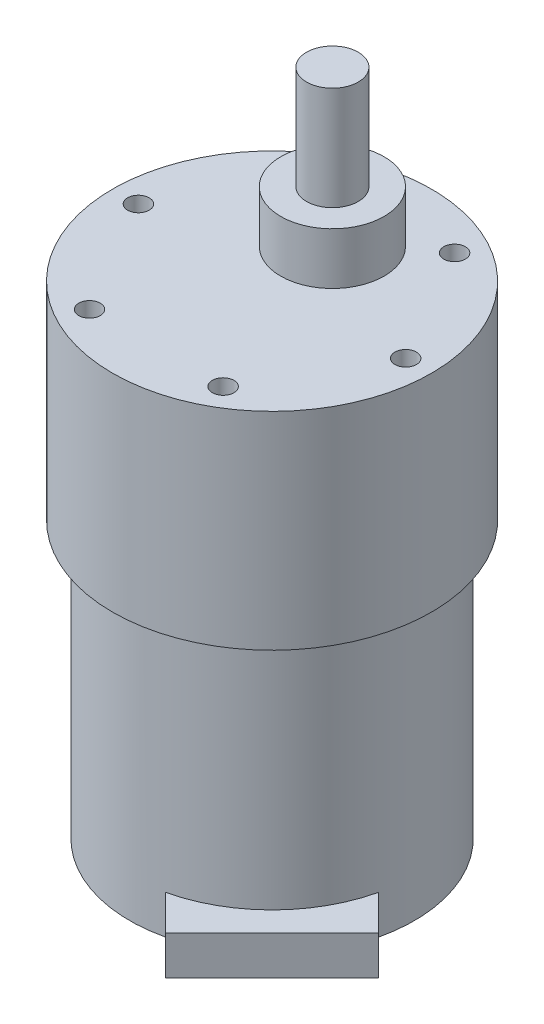
ISO-10303-21;
HEADER;
FILE_DESCRIPTION(('STEP AP214'),'2;1');
FILE_NAME('part.step','',(''),(''),'','','');
FILE_SCHEMA(('AUTOMOTIVE_DESIGN { 1 0 10303 214 1 1 1 1 }'));
ENDSEC;
DATA;
#1=APPLICATION_CONTEXT('core data for automotive mechanical design processes');
#2=APPLICATION_PROTOCOL_DEFINITION('international standard','automotive_design',2000,#1);
#3=PRODUCT_CONTEXT('',#1,'mechanical');
#4=PRODUCT('Part','Part','',(#3));
#5=PRODUCT_RELATED_PRODUCT_CATEGORY('part','',(#4));
#6=PRODUCT_DEFINITION_FORMATION('','',#4);
#7=PRODUCT_DEFINITION_CONTEXT('part definition',#1,'design');
#8=PRODUCT_DEFINITION('design','',#6,#7);
#9=PRODUCT_DEFINITION_SHAPE('','',#8);
#10=(LENGTH_UNIT() NAMED_UNIT(*) SI_UNIT(.MILLI.,.METRE.));
#11=(NAMED_UNIT(*) PLANE_ANGLE_UNIT() SI_UNIT($,.RADIAN.));
#12=(NAMED_UNIT(*) SI_UNIT($,.STERADIAN.) SOLID_ANGLE_UNIT());
#13=UNCERTAINTY_MEASURE_WITH_UNIT(LENGTH_MEASURE(1.E-05),#10,'distance_accuracy_value','');
#14=(GEOMETRIC_REPRESENTATION_CONTEXT(3) GLOBAL_UNCERTAINTY_ASSIGNED_CONTEXT((#13)) GLOBAL_UNIT_ASSIGNED_CONTEXT((#10,
#11,#12)) REPRESENTATION_CONTEXT('',''));
#15=CARTESIAN_POINT('',(0.,0.,0.));
#16=DIRECTION('',(0.,0.,1.));
#17=DIRECTION('',(1.,0.,0.));
#18=AXIS2_PLACEMENT_3D('',#15,#16,#17);
#19=CARTESIAN_POINT('',(0.,62.,-7.));
#20=DIRECTION('',(0.,1.,0.));
#21=DIRECTION('',(0.,0.,1.));
#22=AXIS2_PLACEMENT_3D('',#19,#20,#21);
#23=PLANE('',#22);
#24=CARTESIAN_POINT('',(0.,62.,-7.));
#25=DIRECTION('',(0.,1.,0.));
#26=DIRECTION('',(0.,0.,1.));
#27=AXIS2_PLACEMENT_3D('',#24,#25,#26);
#28=CIRCLE('',#27,6.);
#29=CARTESIAN_POINT('',(0.,62.,-0.999999999999999));
#30=VERTEX_POINT('',#29);
#31=EDGE_CURVE('E169',#30,#30,#28,.T.);
#32=ORIENTED_EDGE('',*,*,#31,.T.);
#33=EDGE_LOOP('',(#32));
#34=FACE_BOUND('',#33,.T.);
#35=CARTESIAN_POINT('',(0.,62.,-7.));
#36=DIRECTION('',(0.,1.,0.));
#37=DIRECTION('',(0.,0.,1.));
#38=AXIS2_PLACEMENT_3D('',#35,#36,#37);
#39=CIRCLE('',#38,3.);
#40=CARTESIAN_POINT('',(0.,62.,-4.));
#41=VERTEX_POINT('',#40);
#42=EDGE_CURVE('E162',#41,#41,#39,.T.);
#43=ORIENTED_EDGE('',*,*,#42,.F.);
#44=EDGE_LOOP('',(#43));
#45=FACE_BOUND('',#44,.T.);
#46=ADVANCED_FACE('F36',(#34,#45),#23,.T.);
#47=CARTESIAN_POINT('',(0.,56.,0.));
#48=DIRECTION('',(0.,1.,0.));
#49=DIRECTION('',(0.,0.,1.));
#50=AXIS2_PLACEMENT_3D('',#47,#48,#49);
#51=PLANE('',#50);
#52=CARTESIAN_POINT('',(-7.74999999999992,56.,-13.4233937586588));
#53=DIRECTION('',(0.,1.,0.));
#54=DIRECTION('',(0.,0.,1.));
#55=AXIS2_PLACEMENT_3D('',#52,#53,#54);
#56=CIRCLE('',#55,1.25);
#57=CARTESIAN_POINT('',(-7.74999999999992,56.,-12.1733937586588));
#58=VERTEX_POINT('',#57);
#59=EDGE_CURVE('E124',#58,#58,#56,.T.);
#60=ORIENTED_EDGE('',*,*,#59,.F.);
#61=EDGE_LOOP('',(#60));
#62=FACE_BOUND('',#61,.T.);
#63=CARTESIAN_POINT('',(7.75000000000007,56.,-13.4233937586588));
#64=DIRECTION('',(0.,1.,0.));
#65=DIRECTION('',(0.,0.,1.));
#66=AXIS2_PLACEMENT_3D('',#63,#64,#65);
#67=CIRCLE('',#66,1.25);
#68=CARTESIAN_POINT('',(7.75000000000007,56.,-12.1733937586588));
#69=VERTEX_POINT('',#68);
#70=EDGE_CURVE('E132',#69,#69,#67,.T.);
#71=ORIENTED_EDGE('',*,*,#70,.F.);
#72=EDGE_LOOP('',(#71));
#73=FACE_BOUND('',#72,.T.);
#74=CARTESIAN_POINT('',(15.5,56.,0.));
#75=DIRECTION('',(0.,1.,0.));
#76=DIRECTION('',(0.,0.,1.));
#77=AXIS2_PLACEMENT_3D('',#74,#75,#76);
#78=CIRCLE('',#77,1.25);
#79=CARTESIAN_POINT('',(15.5,56.,1.25000000000008));
#80=VERTEX_POINT('',#79);
#81=EDGE_CURVE('E138',#80,#80,#78,.T.);
#82=ORIENTED_EDGE('',*,*,#81,.F.);
#83=EDGE_LOOP('',(#82));
#84=FACE_BOUND('',#83,.T.);
#85=CARTESIAN_POINT('',(7.74999999999993,56.,13.4233937586588));
#86=DIRECTION('',(0.,1.,0.));
#87=DIRECTION('',(0.,0.,1.));
#88=AXIS2_PLACEMENT_3D('',#85,#86,#87);
#89=CIRCLE('',#88,1.25);
#90=CARTESIAN_POINT('',(7.74999999999993,56.,14.6733937586588));
#91=VERTEX_POINT('',#90);
#92=EDGE_CURVE('E144',#91,#91,#89,.T.);
#93=ORIENTED_EDGE('',*,*,#92,.F.);
#94=EDGE_LOOP('',(#93));
#95=FACE_BOUND('',#94,.T.);
#96=CARTESIAN_POINT('',(-7.75000000000007,56.,13.4233937586588));
#97=DIRECTION('',(0.,1.,0.));
#98=DIRECTION('',(0.,0.,1.));
#99=AXIS2_PLACEMENT_3D('',#96,#97,#98);
#100=CIRCLE('',#99,1.25);
#101=CARTESIAN_POINT('',(-7.75000000000007,56.,14.6733937586588));
#102=VERTEX_POINT('',#101);
#103=EDGE_CURVE('E150',#102,#102,#100,.T.);
#104=ORIENTED_EDGE('',*,*,#103,.F.);
#105=EDGE_LOOP('',(#104));
#106=FACE_BOUND('',#105,.T.);
#107=CARTESIAN_POINT('',(-15.5,56.,0.));
#108=DIRECTION('',(0.,1.,0.));
#109=DIRECTION('',(0.,0.,1.));
#110=AXIS2_PLACEMENT_3D('',#107,#108,#109);
#111=CIRCLE('',#110,1.25);
#112=CARTESIAN_POINT('',(-15.5,56.,1.24999999999991));
#113=VERTEX_POINT('',#112);
#114=EDGE_CURVE('E156',#113,#113,#111,.T.);
#115=ORIENTED_EDGE('',*,*,#114,.F.);
#116=EDGE_LOOP('',(#115));
#117=FACE_BOUND('',#116,.T.);
#118=CARTESIAN_POINT('',(0.,56.,0.));
#119=DIRECTION('',(0.,1.,0.));
#120=DIRECTION('',(0.,0.,1.));
#121=AXIS2_PLACEMENT_3D('',#118,#119,#120);
#122=CIRCLE('',#121,18.5);
#123=CARTESIAN_POINT('',(0.,56.,18.5));
#124=VERTEX_POINT('',#123);
#125=EDGE_CURVE('E175',#124,#124,#122,.T.);
#126=ORIENTED_EDGE('',*,*,#125,.T.);
#127=EDGE_LOOP('',(#126));
#128=FACE_BOUND('',#127,.T.);
#129=CARTESIAN_POINT('',(0.,56.,-7.));
#130=DIRECTION('',(0.,1.,0.));
#131=DIRECTION('',(0.,0.,1.));
#132=AXIS2_PLACEMENT_3D('',#129,#130,#131);
#133=CIRCLE('',#132,6.);
#134=CARTESIAN_POINT('',(0.,56.,-0.999999999999999));
#135=VERTEX_POINT('',#134);
#136=EDGE_CURVE('E166',#135,#135,#133,.T.);
#137=ORIENTED_EDGE('',*,*,#136,.F.);
#138=EDGE_LOOP('',(#137));
#139=FACE_BOUND('',#138,.T.);
#140=ADVANCED_FACE('F196',(#62,#73,#84,#95,#106,#117,#128,#139),#51,.T.);
#141=CARTESIAN_POINT('',(0.,32.,0.));
#142=DIRECTION('',(0.,-1.,0.));
#143=DIRECTION('',(0.,0.,-1.));
#144=AXIS2_PLACEMENT_3D('',#141,#142,#143);
#145=CYLINDRICAL_SURFACE('',#144,16.5);
#146=CARTESIAN_POINT('',(0.,32.,0.));
#147=DIRECTION('',(0.,1.,0.));
#148=DIRECTION('',(0.,0.,1.));
#149=AXIS2_PLACEMENT_3D('',#146,#147,#148);
#150=CIRCLE('',#149,16.5);
#151=CARTESIAN_POINT('',(0.,32.,16.5));
#152=VERTEX_POINT('',#151);
#153=EDGE_CURVE('E44',#152,#152,#150,.T.);
#154=ORIENTED_EDGE('',*,*,#153,.F.);
#155=EDGE_LOOP('',(#154));
#156=FACE_BOUND('',#155,.T.);
#157=CARTESIAN_POINT('',(0.,4.5,0.));
#158=DIRECTION('',(0.,1.,0.));
#159=DIRECTION('',(0.,0.,1.));
#160=AXIS2_PLACEMENT_3D('',#157,#158,#159);
#161=CIRCLE('',#160,16.5);
#162=CARTESIAN_POINT('',(3.70441563631082,4.5,16.0787843070755));
#163=VERTEX_POINT('',#162);
#164=CARTESIAN_POINT('',(16.0787843070754,4.5,3.7044156363109));
#165=VERTEX_POINT('',#164);
#166=EDGE_CURVE('E11',#163,#165,#161,.T.);
#167=ORIENTED_EDGE('',*,*,#166,.T.);
#168=DIRECTION('',(0.,-1.,0.));
#169=VECTOR('',#168,1.);
#170=CARTESIAN_POINT('',(16.0787843070754,4.5,3.70441563631089));
#171=LINE('',#170,#169);
#172=CARTESIAN_POINT('',(16.0787843070754,0.,3.70441563631089));
#173=VERTEX_POINT('',#172);
#174=EDGE_CURVE('E103',#165,#173,#171,.T.);
#175=ORIENTED_EDGE('',*,*,#174,.T.);
#176=CARTESIAN_POINT('',(0.,0.,0.));
#177=DIRECTION('',(0.,1.,0.));
#178=DIRECTION('',(0.,0.,1.));
#179=AXIS2_PLACEMENT_3D('',#176,#177,#178);
#180=CIRCLE('',#179,16.5);
#181=CARTESIAN_POINT('',(3.70441563631083,0.,16.0787843070755));
#182=VERTEX_POINT('',#181);
#183=EDGE_CURVE('E178',#173,#182,#180,.T.);
#184=ORIENTED_EDGE('',*,*,#183,.T.);
#185=DIRECTION('',(0.,-1.,0.));
#186=VECTOR('',#185,1.);
#187=CARTESIAN_POINT('',(3.70441563631083,4.5,16.0787843070755));
#188=LINE('',#187,#186);
#189=EDGE_CURVE('E54',#163,#182,#188,.T.);
#190=ORIENTED_EDGE('',*,*,#189,.F.);
#191=EDGE_LOOP('',(#167,#175,#184,#190));
#192=FACE_BOUND('',#191,.T.);
#193=ADVANCED_FACE('F38',(#156,#192),#145,.T.);
#194=CARTESIAN_POINT('',(0.,0.,0.));
#195=DIRECTION('',(0.,1.,0.));
#196=DIRECTION('',(0.,0.,1.));
#197=AXIS2_PLACEMENT_3D('',#194,#195,#196);
#198=PLANE('',#197);
#199=ORIENTED_EDGE('',*,*,#183,.F.);
#200=DIRECTION('',(0.707106781186548,0.,0.707106781186547));
#201=VECTOR('',#200,1.);
#202=CARTESIAN_POINT('',(20.1878986028759,0.,7.81352993211137));
#203=LINE('',#202,#201);
#204=CARTESIAN_POINT('',(20.1878986028759,0.,7.81352993211137));
#205=VERTEX_POINT('',#204);
#206=EDGE_CURVE('E121',#173,#205,#203,.T.);
#207=ORIENTED_EDGE('',*,*,#206,.T.);
#208=DIRECTION('',(-0.707106781186548,0.,0.707106781186548));
#209=VECTOR('',#208,1.);
#210=CARTESIAN_POINT('',(7.81352993211133,0.,20.187898602876));
#211=LINE('',#210,#209);
#212=CARTESIAN_POINT('',(7.81352993211133,0.,20.187898602876));
#213=VERTEX_POINT('',#212);
#214=EDGE_CURVE('E98',#205,#213,#211,.T.);
#215=ORIENTED_EDGE('',*,*,#214,.T.);
#216=DIRECTION('',(-0.707106781186547,0.,-0.707106781186548));
#217=VECTOR('',#216,1.);
#218=CARTESIAN_POINT('',(3.70441563631083,0.,16.0787843070755));
#219=LINE('',#218,#217);
#220=EDGE_CURVE('E118',#213,#182,#219,.T.);
#221=ORIENTED_EDGE('',*,*,#220,.T.);
#222=EDGE_LOOP('',(#199,#207,#215,#221));
#223=FACE_BOUND('',#222,.T.);
#224=ADVANCED_FACE('F186',(#223),#198,.F.);
#225=CARTESIAN_POINT('',(0.,32.,0.));
#226=DIRECTION('',(0.,1.,0.));
#227=DIRECTION('',(0.,0.,1.));
#228=AXIS2_PLACEMENT_3D('',#225,#226,#227);
#229=PLANE('',#228);
#230=CARTESIAN_POINT('',(0.,32.,0.));
#231=DIRECTION('',(0.,1.,0.));
#232=DIRECTION('',(0.,0.,1.));
#233=AXIS2_PLACEMENT_3D('',#230,#231,#232);
#234=CIRCLE('',#233,18.5);
#235=CARTESIAN_POINT('',(0.,32.,18.5));
#236=VERTEX_POINT('',#235);
#237=EDGE_CURVE('E172',#236,#236,#234,.T.);
#238=ORIENTED_EDGE('',*,*,#237,.F.);
#239=EDGE_LOOP('',(#238));
#240=FACE_BOUND('',#239,.T.);
#241=ORIENTED_EDGE('',*,*,#153,.T.);
#242=EDGE_LOOP('',(#241));
#243=FACE_BOUND('',#242,.T.);
#244=ADVANCED_FACE('F188',(#240,#243),#229,.F.);
#245=CARTESIAN_POINT('',(0.,56.,0.));
#246=DIRECTION('',(0.,-1.,0.));
#247=DIRECTION('',(0.,0.,-1.));
#248=AXIS2_PLACEMENT_3D('',#245,#246,#247);
#249=CYLINDRICAL_SURFACE('',#248,18.5);
#250=ORIENTED_EDGE('',*,*,#125,.F.);
#251=EDGE_LOOP('',(#250));
#252=FACE_BOUND('',#251,.T.);
#253=ORIENTED_EDGE('',*,*,#237,.T.);
#254=EDGE_LOOP('',(#253));
#255=FACE_BOUND('',#254,.T.);
#256=ADVANCED_FACE('F193',(#252,#255),#249,.T.);
#257=CARTESIAN_POINT('',(0.,62.,-7.));
#258=DIRECTION('',(0.,-1.,0.));
#259=DIRECTION('',(0.,0.,-1.));
#260=AXIS2_PLACEMENT_3D('',#257,#258,#259);
#261=CYLINDRICAL_SURFACE('',#260,6.);
#262=ORIENTED_EDGE('',*,*,#31,.F.);
#263=EDGE_LOOP('',(#262));
#264=FACE_BOUND('',#263,.T.);
#265=ORIENTED_EDGE('',*,*,#136,.T.);
#266=EDGE_LOOP('',(#265));
#267=FACE_BOUND('',#266,.T.);
#268=ADVANCED_FACE('F212',(#264,#267),#261,.T.);
#269=CARTESIAN_POINT('',(0.,74.,-7.));
#270=DIRECTION('',(0.,-1.,0.));
#271=DIRECTION('',(0.,0.,-1.));
#272=AXIS2_PLACEMENT_3D('',#269,#270,#271);
#273=CYLINDRICAL_SURFACE('',#272,3.);
#274=CARTESIAN_POINT('',(0.,74.,-7.));
#275=DIRECTION('',(0.,1.,0.));
#276=DIRECTION('',(0.,0.,1.));
#277=AXIS2_PLACEMENT_3D('',#274,#275,#276);
#278=CIRCLE('',#277,3.);
#279=CARTESIAN_POINT('',(0.,74.,-4.));
#280=VERTEX_POINT('',#279);
#281=EDGE_CURVE('E163',#280,#280,#278,.T.);
#282=ORIENTED_EDGE('',*,*,#281,.F.);
#283=EDGE_LOOP('',(#282));
#284=FACE_BOUND('',#283,.T.);
#285=ORIENTED_EDGE('',*,*,#42,.T.);
#286=EDGE_LOOP('',(#285));
#287=FACE_BOUND('',#286,.T.);
#288=ADVANCED_FACE('F210',(#284,#287),#273,.T.);
#289=CARTESIAN_POINT('',(0.,74.,-7.));
#290=DIRECTION('',(0.,1.,0.));
#291=DIRECTION('',(0.,0.,1.));
#292=AXIS2_PLACEMENT_3D('',#289,#290,#291);
#293=PLANE('',#292);
#294=ORIENTED_EDGE('',*,*,#281,.T.);
#295=EDGE_LOOP('',(#294));
#296=FACE_BOUND('',#295,.T.);
#297=ADVANCED_FACE('F240',(#296),#293,.T.);
#298=CARTESIAN_POINT('',(-15.5,52.7,0.));
#299=DIRECTION('',(0.,1.,0.));
#300=DIRECTION('',(0.,0.,1.));
#301=AXIS2_PLACEMENT_3D('',#298,#299,#300);
#302=CONICAL_SURFACE('',#301,1.25,1.02974425867665);
#303=CARTESIAN_POINT('',(-15.5,51.9489242262156,0.));
#304=VERTEX_POINT('',#303);
#305=VERTEX_LOOP('',#304);
#306=FACE_BOUND('',#305,.T.);
#307=CARTESIAN_POINT('',(-15.5,52.7,0.));
#308=DIRECTION('',(0.,1.,0.));
#309=DIRECTION('',(0.,0.,1.));
#310=AXIS2_PLACEMENT_3D('',#307,#308,#309);
#311=CIRCLE('',#310,1.25);
#312=CARTESIAN_POINT('',(-15.5,52.7,1.24999999999991));
#313=VERTEX_POINT('',#312);
#314=EDGE_CURVE('E159',#313,#313,#311,.T.);
#315=ORIENTED_EDGE('',*,*,#314,.T.);
#316=EDGE_LOOP('',(#315));
#317=FACE_BOUND('',#316,.T.);
#318=ADVANCED_FACE('F247',(#306,#317),#302,.F.);
#319=CARTESIAN_POINT('',(-15.5,56.,0.));
#320=DIRECTION('',(0.,1.,0.));
#321=DIRECTION('',(0.,0.,1.));
#322=AXIS2_PLACEMENT_3D('',#319,#320,#321);
#323=CYLINDRICAL_SURFACE('',#322,1.25);
#324=ORIENTED_EDGE('',*,*,#314,.F.);
#325=EDGE_LOOP('',(#324));
#326=FACE_BOUND('',#325,.T.);
#327=ORIENTED_EDGE('',*,*,#114,.T.);
#328=EDGE_LOOP('',(#327));
#329=FACE_BOUND('',#328,.T.);
#330=ADVANCED_FACE('F255',(#326,#329),#323,.F.);
#331=CARTESIAN_POINT('',(-7.75000000000007,52.7,13.4233937586588));
#332=DIRECTION('',(0.,1.,0.));
#333=DIRECTION('',(0.,0.,1.));
#334=AXIS2_PLACEMENT_3D('',#331,#332,#333);
#335=CONICAL_SURFACE('',#334,1.25,1.02974425867665);
#336=CARTESIAN_POINT('',(-7.75000000000007,51.9489242262156,13.4233937586588));
#337=VERTEX_POINT('',#336);
#338=VERTEX_LOOP('',#337);
#339=FACE_BOUND('',#338,.T.);
#340=CARTESIAN_POINT('',(-7.75000000000007,52.7,13.4233937586588));
#341=DIRECTION('',(0.,1.,0.));
#342=DIRECTION('',(0.,0.,1.));
#343=AXIS2_PLACEMENT_3D('',#340,#341,#342);
#344=CIRCLE('',#343,1.25);
#345=CARTESIAN_POINT('',(-7.75000000000007,52.7,14.6733937586588));
#346=VERTEX_POINT('',#345);
#347=EDGE_CURVE('E153',#346,#346,#344,.T.);
#348=ORIENTED_EDGE('',*,*,#347,.T.);
#349=EDGE_LOOP('',(#348));
#350=FACE_BOUND('',#349,.T.);
#351=ADVANCED_FACE('F263',(#339,#350),#335,.F.);
#352=CARTESIAN_POINT('',(-7.75000000000007,56.,13.4233937586588));
#353=DIRECTION('',(0.,1.,0.));
#354=DIRECTION('',(0.,0.,1.));
#355=AXIS2_PLACEMENT_3D('',#352,#353,#354);
#356=CYLINDRICAL_SURFACE('',#355,1.25);
#357=ORIENTED_EDGE('',*,*,#347,.F.);
#358=EDGE_LOOP('',(#357));
#359=FACE_BOUND('',#358,.T.);
#360=ORIENTED_EDGE('',*,*,#103,.T.);
#361=EDGE_LOOP('',(#360));
#362=FACE_BOUND('',#361,.T.);
#363=ADVANCED_FACE('F271',(#359,#362),#356,.F.);
#364=CARTESIAN_POINT('',(7.74999999999993,52.7,13.4233937586588));
#365=DIRECTION('',(0.,1.,0.));
#366=DIRECTION('',(0.,0.,1.));
#367=AXIS2_PLACEMENT_3D('',#364,#365,#366);
#368=CONICAL_SURFACE('',#367,1.25,1.02974425867665);
#369=CARTESIAN_POINT('',(7.74999999999993,51.9489242262156,13.4233937586588));
#370=VERTEX_POINT('',#369);
#371=VERTEX_LOOP('',#370);
#372=FACE_BOUND('',#371,.T.);
#373=CARTESIAN_POINT('',(7.74999999999993,52.7,13.4233937586588));
#374=DIRECTION('',(0.,1.,0.));
#375=DIRECTION('',(0.,0.,1.));
#376=AXIS2_PLACEMENT_3D('',#373,#374,#375);
#377=CIRCLE('',#376,1.25);
#378=CARTESIAN_POINT('',(7.74999999999993,52.7,14.6733937586588));
#379=VERTEX_POINT('',#378);
#380=EDGE_CURVE('E147',#379,#379,#377,.T.);
#381=ORIENTED_EDGE('',*,*,#380,.T.);
#382=EDGE_LOOP('',(#381));
#383=FACE_BOUND('',#382,.T.);
#384=ADVANCED_FACE('F279',(#372,#383),#368,.F.);
#385=CARTESIAN_POINT('',(7.74999999999993,56.,13.4233937586588));
#386=DIRECTION('',(0.,1.,0.));
#387=DIRECTION('',(0.,0.,1.));
#388=AXIS2_PLACEMENT_3D('',#385,#386,#387);
#389=CYLINDRICAL_SURFACE('',#388,1.25);
#390=ORIENTED_EDGE('',*,*,#380,.F.);
#391=EDGE_LOOP('',(#390));
#392=FACE_BOUND('',#391,.T.);
#393=ORIENTED_EDGE('',*,*,#92,.T.);
#394=EDGE_LOOP('',(#393));
#395=FACE_BOUND('',#394,.T.);
#396=ADVANCED_FACE('F287',(#392,#395),#389,.F.);
#397=CARTESIAN_POINT('',(15.5,52.7,0.));
#398=DIRECTION('',(0.,1.,0.));
#399=DIRECTION('',(0.,0.,1.));
#400=AXIS2_PLACEMENT_3D('',#397,#398,#399);
#401=CONICAL_SURFACE('',#400,1.25,1.02974425867665);
#402=CARTESIAN_POINT('',(15.5,51.9489242262156,0.));
#403=VERTEX_POINT('',#402);
#404=VERTEX_LOOP('',#403);
#405=FACE_BOUND('',#404,.T.);
#406=CARTESIAN_POINT('',(15.5,52.7,0.));
#407=DIRECTION('',(0.,1.,0.));
#408=DIRECTION('',(0.,0.,1.));
#409=AXIS2_PLACEMENT_3D('',#406,#407,#408);
#410=CIRCLE('',#409,1.25);
#411=CARTESIAN_POINT('',(15.5,52.7,1.25000000000008));
#412=VERTEX_POINT('',#411);
#413=EDGE_CURVE('E141',#412,#412,#410,.T.);
#414=ORIENTED_EDGE('',*,*,#413,.T.);
#415=EDGE_LOOP('',(#414));
#416=FACE_BOUND('',#415,.T.);
#417=ADVANCED_FACE('F295',(#405,#416),#401,.F.);
#418=CARTESIAN_POINT('',(15.5,56.,0.));
#419=DIRECTION('',(0.,1.,0.));
#420=DIRECTION('',(0.,0.,1.));
#421=AXIS2_PLACEMENT_3D('',#418,#419,#420);
#422=CYLINDRICAL_SURFACE('',#421,1.25);
#423=ORIENTED_EDGE('',*,*,#413,.F.);
#424=EDGE_LOOP('',(#423));
#425=FACE_BOUND('',#424,.T.);
#426=ORIENTED_EDGE('',*,*,#81,.T.);
#427=EDGE_LOOP('',(#426));
#428=FACE_BOUND('',#427,.T.);
#429=ADVANCED_FACE('F303',(#425,#428),#422,.F.);
#430=CARTESIAN_POINT('',(7.75000000000007,52.7,-13.4233937586588));
#431=DIRECTION('',(0.,1.,0.));
#432=DIRECTION('',(0.,0.,1.));
#433=AXIS2_PLACEMENT_3D('',#430,#431,#432);
#434=CONICAL_SURFACE('',#433,1.25,1.02974425867665);
#435=CARTESIAN_POINT('',(7.75000000000007,51.9489242262156,-13.4233937586588));
#436=VERTEX_POINT('',#435);
#437=VERTEX_LOOP('',#436);
#438=FACE_BOUND('',#437,.T.);
#439=CARTESIAN_POINT('',(7.75000000000007,52.7,-13.4233937586588));
#440=DIRECTION('',(0.,1.,0.));
#441=DIRECTION('',(0.,0.,1.));
#442=AXIS2_PLACEMENT_3D('',#439,#440,#441);
#443=CIRCLE('',#442,1.25);
#444=CARTESIAN_POINT('',(7.75000000000007,52.7,-12.1733937586588));
#445=VERTEX_POINT('',#444);
#446=EDGE_CURVE('E135',#445,#445,#443,.T.);
#447=ORIENTED_EDGE('',*,*,#446,.T.);
#448=EDGE_LOOP('',(#447));
#449=FACE_BOUND('',#448,.T.);
#450=ADVANCED_FACE('F311',(#438,#449),#434,.F.);
#451=CARTESIAN_POINT('',(7.75000000000007,56.,-13.4233937586588));
#452=DIRECTION('',(0.,1.,0.));
#453=DIRECTION('',(0.,0.,1.));
#454=AXIS2_PLACEMENT_3D('',#451,#452,#453);
#455=CYLINDRICAL_SURFACE('',#454,1.25);
#456=ORIENTED_EDGE('',*,*,#446,.F.);
#457=EDGE_LOOP('',(#456));
#458=FACE_BOUND('',#457,.T.);
#459=ORIENTED_EDGE('',*,*,#70,.T.);
#460=EDGE_LOOP('',(#459));
#461=FACE_BOUND('',#460,.T.);
#462=ADVANCED_FACE('F319',(#458,#461),#455,.F.);
#463=CARTESIAN_POINT('',(-7.74999999999992,52.7,-13.4233937586588));
#464=DIRECTION('',(0.,1.,0.));
#465=DIRECTION('',(0.,0.,1.));
#466=AXIS2_PLACEMENT_3D('',#463,#464,#465);
#467=CONICAL_SURFACE('',#466,1.25,1.02974425867665);
#468=CARTESIAN_POINT('',(-7.74999999999993,51.9489242262156,-13.4233937586588));
#469=VERTEX_POINT('',#468);
#470=VERTEX_LOOP('',#469);
#471=FACE_BOUND('',#470,.T.);
#472=CARTESIAN_POINT('',(-7.74999999999992,52.7,-13.4233937586588));
#473=DIRECTION('',(0.,1.,0.));
#474=DIRECTION('',(0.,0.,1.));
#475=AXIS2_PLACEMENT_3D('',#472,#473,#474);
#476=CIRCLE('',#475,1.25);
#477=CARTESIAN_POINT('',(-7.74999999999992,52.7,-12.1733937586588));
#478=VERTEX_POINT('',#477);
#479=EDGE_CURVE('E129',#478,#478,#476,.T.);
#480=ORIENTED_EDGE('',*,*,#479,.T.);
#481=EDGE_LOOP('',(#480));
#482=FACE_BOUND('',#481,.T.);
#483=ADVANCED_FACE('F327',(#471,#482),#467,.F.);
#484=CARTESIAN_POINT('',(-7.74999999999992,56.,-13.4233937586588));
#485=DIRECTION('',(0.,1.,0.));
#486=DIRECTION('',(0.,0.,1.));
#487=AXIS2_PLACEMENT_3D('',#484,#485,#486);
#488=CYLINDRICAL_SURFACE('',#487,1.25);
#489=ORIENTED_EDGE('',*,*,#479,.F.);
#490=EDGE_LOOP('',(#489));
#491=FACE_BOUND('',#490,.T.);
#492=ORIENTED_EDGE('',*,*,#59,.T.);
#493=EDGE_LOOP('',(#492));
#494=FACE_BOUND('',#493,.T.);
#495=ADVANCED_FACE('F335',(#491,#494),#488,.F.);
#496=CARTESIAN_POINT('',(0.,4.5,0.));
#497=DIRECTION('',(0.,1.,0.));
#498=DIRECTION('',(0.,0.,1.));
#499=AXIS2_PLACEMENT_3D('',#496,#497,#498);
#500=PLANE('',#499);
#501=ORIENTED_EDGE('',*,*,#166,.F.);
#502=DIRECTION('',(-0.707106781186547,0.,-0.707106781186548));
#503=VECTOR('',#502,1.);
#504=CARTESIAN_POINT('',(3.70441563631083,4.5,16.0787843070755));
#505=LINE('',#504,#503);
#506=CARTESIAN_POINT('',(7.81352993211133,4.5,20.187898602876));
#507=VERTEX_POINT('',#506);
#508=EDGE_CURVE('E109',#507,#163,#505,.T.);
#509=ORIENTED_EDGE('',*,*,#508,.F.);
#510=DIRECTION('',(-0.707106781186548,0.,0.707106781186548));
#511=VECTOR('',#510,1.);
#512=CARTESIAN_POINT('',(7.81352993211133,4.5,20.187898602876));
#513=LINE('',#512,#511);
#514=CARTESIAN_POINT('',(20.1878986028759,4.5,7.81352993211137));
#515=VERTEX_POINT('',#514);
#516=EDGE_CURVE('E96',#515,#507,#513,.T.);
#517=ORIENTED_EDGE('',*,*,#516,.F.);
#518=DIRECTION('',(0.707106781186548,0.,0.707106781186547));
#519=VECTOR('',#518,1.);
#520=CARTESIAN_POINT('',(20.1878986028759,4.5,7.81352993211137));
#521=LINE('',#520,#519);
#522=EDGE_CURVE('E106',#165,#515,#521,.T.);
#523=ORIENTED_EDGE('',*,*,#522,.F.);
#524=EDGE_LOOP('',(#501,#509,#517,#523));
#525=FACE_BOUND('',#524,.T.);
#526=ADVANCED_FACE('F112',(#525),#500,.T.);
#527=CARTESIAN_POINT('',(3.70441563631083,4.5,16.0787843070755));
#528=DIRECTION('',(-0.707106781186548,0.,0.707106781186547));
#529=DIRECTION('',(0.707106781186547,0.,0.707106781186548));
#530=AXIS2_PLACEMENT_3D('',#527,#528,#529);
#531=PLANE('',#530);
#532=ORIENTED_EDGE('',*,*,#220,.F.);
#533=DIRECTION('',(0.,-1.,0.));
#534=VECTOR('',#533,1.);
#535=CARTESIAN_POINT('',(7.81352993211133,4.5,20.187898602876));
#536=LINE('',#535,#534);
#537=EDGE_CURVE('E102',#507,#213,#536,.T.);
#538=ORIENTED_EDGE('',*,*,#537,.F.);
#539=ORIENTED_EDGE('',*,*,#508,.T.);
#540=ORIENTED_EDGE('',*,*,#189,.T.);
#541=EDGE_LOOP('',(#532,#538,#539,#540));
#542=FACE_BOUND('',#541,.T.);
#543=ADVANCED_FACE('F185',(#542),#531,.T.);
#544=CARTESIAN_POINT('',(7.81352993211133,4.5,20.187898602876));
#545=DIRECTION('',(0.707106781186547,0.,0.707106781186547));
#546=DIRECTION('',(0.707106781186548,0.,-0.707106781186548));
#547=AXIS2_PLACEMENT_3D('',#544,#545,#546);
#548=PLANE('',#547);
#549=ORIENTED_EDGE('',*,*,#214,.F.);
#550=DIRECTION('',(0.,-1.,0.));
#551=VECTOR('',#550,1.);
#552=CARTESIAN_POINT('',(20.1878986028759,4.5,7.81352993211137));
#553=LINE('',#552,#551);
#554=EDGE_CURVE('E92',#515,#205,#553,.T.);
#555=ORIENTED_EDGE('',*,*,#554,.F.);
#556=ORIENTED_EDGE('',*,*,#516,.T.);
#557=ORIENTED_EDGE('',*,*,#537,.T.);
#558=EDGE_LOOP('',(#549,#555,#556,#557));
#559=FACE_BOUND('',#558,.T.);
#560=ADVANCED_FACE('F94',(#559),#548,.T.);
#561=CARTESIAN_POINT('',(20.1878986028759,4.5,7.81352993211137));
#562=DIRECTION('',(0.707106781186547,0.,-0.707106781186548));
#563=DIRECTION('',(-0.707106781186548,0.,-0.707106781186547));
#564=AXIS2_PLACEMENT_3D('',#561,#562,#563);
#565=PLANE('',#564);
#566=ORIENTED_EDGE('',*,*,#206,.F.);
#567=ORIENTED_EDGE('',*,*,#174,.F.);
#568=ORIENTED_EDGE('',*,*,#522,.T.);
#569=ORIENTED_EDGE('',*,*,#554,.T.);
#570=EDGE_LOOP('',(#566,#567,#568,#569));
#571=FACE_BOUND('',#570,.T.);
#572=ADVANCED_FACE('F107',(#571),#565,.T.);
#573=CLOSED_SHELL('',(#46,#140,#193,#224,#244,#256,#268,#288,#297,#318,#330,#351,#363,#384,#396,
#417,#429,#450,#462,#483,#495,#526,#543,#560,#572));
#574=MANIFOLD_SOLID_BREP('B2',#573);
#575=ADVANCED_BREP_SHAPE_REPRESENTATION('',(#18,#574),#14);
#576=SHAPE_DEFINITION_REPRESENTATION(#9,#575);
ENDSEC;
END-ISO-10303-21;
